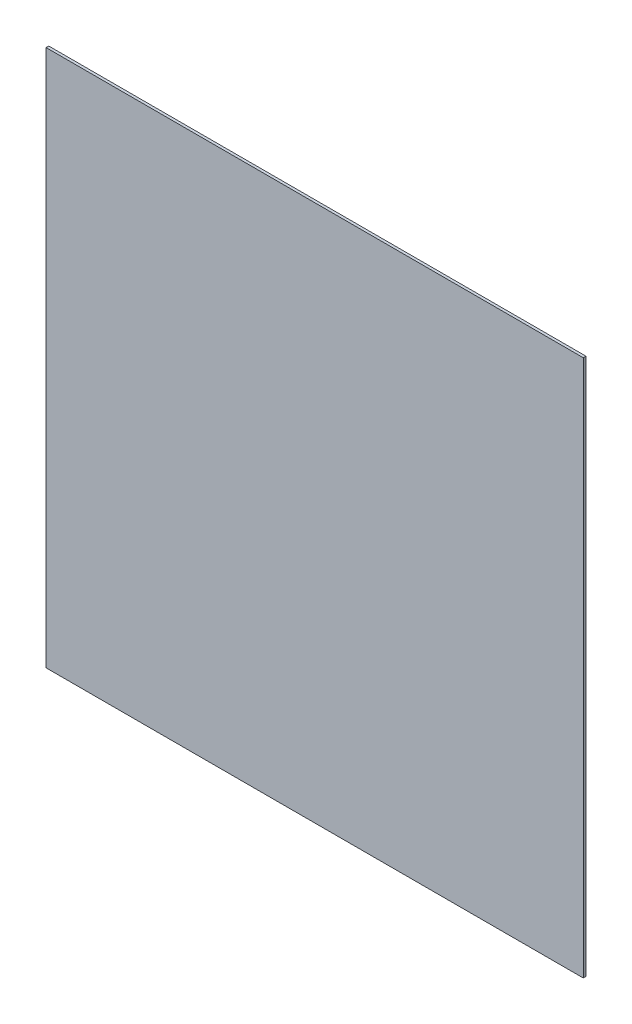
ISO-10303-21;
HEADER;
FILE_DESCRIPTION(('STEP AP214'),'2;1');
FILE_NAME('part.step','',(''),(''),'','','');
FILE_SCHEMA(('AUTOMOTIVE_DESIGN { 1 0 10303 214 1 1 1 1 }'));
ENDSEC;
DATA;
#1=APPLICATION_CONTEXT('core data for automotive mechanical design processes');
#2=APPLICATION_PROTOCOL_DEFINITION('international standard','automotive_design',2000,#1);
#3=PRODUCT_CONTEXT('',#1,'mechanical');
#4=PRODUCT('Part','Part','',(#3));
#5=PRODUCT_RELATED_PRODUCT_CATEGORY('part','',(#4));
#6=PRODUCT_DEFINITION_FORMATION('','',#4);
#7=PRODUCT_DEFINITION_CONTEXT('part definition',#1,'design');
#8=PRODUCT_DEFINITION('design','',#6,#7);
#9=PRODUCT_DEFINITION_SHAPE('','',#8);
#10=(LENGTH_UNIT() NAMED_UNIT(*) SI_UNIT(.MILLI.,.METRE.));
#11=(NAMED_UNIT(*) PLANE_ANGLE_UNIT() SI_UNIT($,.RADIAN.));
#12=(NAMED_UNIT(*) SI_UNIT($,.STERADIAN.) SOLID_ANGLE_UNIT());
#13=UNCERTAINTY_MEASURE_WITH_UNIT(LENGTH_MEASURE(1.E-05),#10,'distance_accuracy_value','');
#14=(GEOMETRIC_REPRESENTATION_CONTEXT(3) GLOBAL_UNCERTAINTY_ASSIGNED_CONTEXT((#13)) GLOBAL_UNIT_ASSIGNED_CONTEXT((#10,
#11,#12)) REPRESENTATION_CONTEXT('',''));
#15=CARTESIAN_POINT('',(0.,0.,0.));
#16=DIRECTION('',(0.,0.,1.));
#17=DIRECTION('',(1.,0.,0.));
#18=AXIS2_PLACEMENT_3D('',#15,#16,#17);
#19=CARTESIAN_POINT('',(-696.145124716553,94.671201814059,5.));
#20=DIRECTION('',(0.,1.,0.));
#21=DIRECTION('',(0.,0.,1.));
#22=AXIS2_PLACEMENT_3D('',#19,#20,#21);
#23=PLANE('',#22);
#24=DIRECTION('',(1.,0.,0.));
#25=VECTOR('',#24,1.);
#26=CARTESIAN_POINT('',(-696.145124716553,94.671201814059,0.));
#27=LINE('',#26,#25);
#28=CARTESIAN_POINT('',(-696.145124716553,94.671201814059,0.));
#29=VERTEX_POINT('',#28);
#30=CARTESIAN_POINT('',(303.854875283447,94.671201814059,0.));
#31=VERTEX_POINT('',#30);
#32=EDGE_CURVE('E98',#29,#31,#27,.T.);
#33=ORIENTED_EDGE('',*,*,#32,.F.);
#34=DIRECTION('',(0.,0.,-1.));
#35=VECTOR('',#34,1.);
#36=CARTESIAN_POINT('',(-696.145124716553,94.671201814059,5.));
#37=LINE('',#36,#35);
#38=CARTESIAN_POINT('',(-696.145124716553,94.671201814059,5.));
#39=VERTEX_POINT('',#38);
#40=EDGE_CURVE('E11',#39,#29,#37,.T.);
#41=ORIENTED_EDGE('',*,*,#40,.F.);
#42=DIRECTION('',(1.,0.,0.));
#43=VECTOR('',#42,1.);
#44=CARTESIAN_POINT('',(-696.145124716553,94.671201814059,5.));
#45=LINE('',#44,#43);
#46=CARTESIAN_POINT('',(303.854875283447,94.671201814059,5.));
#47=VERTEX_POINT('',#46);
#48=EDGE_CURVE('E93',#39,#47,#45,.T.);
#49=ORIENTED_EDGE('',*,*,#48,.T.);
#50=DIRECTION('',(0.,0.,-1.));
#51=VECTOR('',#50,1.);
#52=CARTESIAN_POINT('',(303.854875283447,94.671201814059,5.));
#53=LINE('',#52,#51);
#54=EDGE_CURVE('E36',#47,#31,#53,.T.);
#55=ORIENTED_EDGE('',*,*,#54,.T.);
#56=EDGE_LOOP('',(#33,#41,#49,#55));
#57=FACE_BOUND('',#56,.T.);
#58=ADVANCED_FACE('F33',(#57),#23,.T.);
#59=CARTESIAN_POINT('',(-696.145124716553,94.671201814059,5.));
#60=DIRECTION('',(1.,0.,0.));
#61=DIRECTION('',(0.,0.,-1.));
#62=AXIS2_PLACEMENT_3D('',#59,#60,#61);
#63=PLANE('',#62);
#64=DIRECTION('',(0.,-1.,0.));
#65=VECTOR('',#64,1.);
#66=CARTESIAN_POINT('',(-696.145124716553,94.671201814059,0.));
#67=LINE('',#66,#65);
#68=CARTESIAN_POINT('',(-696.145124716553,-905.328798185941,0.));
#69=VERTEX_POINT('',#68);
#70=EDGE_CURVE('E66',#29,#69,#67,.T.);
#71=ORIENTED_EDGE('',*,*,#70,.T.);
#72=DIRECTION('',(0.,0.,-1.));
#73=VECTOR('',#72,1.);
#74=CARTESIAN_POINT('',(-696.145124716553,-905.328798185941,5.));
#75=LINE('',#74,#73);
#76=CARTESIAN_POINT('',(-696.145124716553,-905.328798185941,5.));
#77=VERTEX_POINT('',#76);
#78=EDGE_CURVE('E42',#77,#69,#75,.T.);
#79=ORIENTED_EDGE('',*,*,#78,.F.);
#80=DIRECTION('',(0.,-1.,0.));
#81=VECTOR('',#80,1.);
#82=CARTESIAN_POINT('',(-696.145124716553,94.671201814059,5.));
#83=LINE('',#82,#81);
#84=EDGE_CURVE('E83',#39,#77,#83,.T.);
#85=ORIENTED_EDGE('',*,*,#84,.F.);
#86=ORIENTED_EDGE('',*,*,#40,.T.);
#87=EDGE_LOOP('',(#71,#79,#85,#86));
#88=FACE_BOUND('',#87,.T.);
#89=ADVANCED_FACE('F108',(#88),#63,.F.);
#90=CARTESIAN_POINT('',(-696.145124716553,-905.328798185941,5.));
#91=DIRECTION('',(0.,1.,0.));
#92=DIRECTION('',(0.,0.,1.));
#93=AXIS2_PLACEMENT_3D('',#90,#91,#92);
#94=PLANE('',#93);
#95=DIRECTION('',(1.,0.,0.));
#96=VECTOR('',#95,1.);
#97=CARTESIAN_POINT('',(-696.145124716553,-905.328798185941,0.));
#98=LINE('',#97,#96);
#99=CARTESIAN_POINT('',(303.854875283447,-905.328798185941,0.));
#100=VERTEX_POINT('',#99);
#101=EDGE_CURVE('E90',#69,#100,#98,.T.);
#102=ORIENTED_EDGE('',*,*,#101,.T.);
#103=DIRECTION('',(0.,0.,-1.));
#104=VECTOR('',#103,1.);
#105=CARTESIAN_POINT('',(303.854875283447,-905.328798185941,5.));
#106=LINE('',#105,#104);
#107=CARTESIAN_POINT('',(303.854875283447,-905.328798185941,5.));
#108=VERTEX_POINT('',#107);
#109=EDGE_CURVE('E87',#108,#100,#106,.T.);
#110=ORIENTED_EDGE('',*,*,#109,.F.);
#111=DIRECTION('',(1.,0.,0.));
#112=VECTOR('',#111,1.);
#113=CARTESIAN_POINT('',(-696.145124716553,-905.328798185941,5.));
#114=LINE('',#113,#112);
#115=EDGE_CURVE('E78',#77,#108,#114,.T.);
#116=ORIENTED_EDGE('',*,*,#115,.F.);
#117=ORIENTED_EDGE('',*,*,#78,.T.);
#118=EDGE_LOOP('',(#102,#110,#116,#117));
#119=FACE_BOUND('',#118,.T.);
#120=ADVANCED_FACE('F88',(#119),#94,.F.);
#121=CARTESIAN_POINT('',(303.854875283447,94.671201814059,5.));
#122=DIRECTION('',(1.,0.,0.));
#123=DIRECTION('',(0.,1.,0.));
#124=AXIS2_PLACEMENT_3D('',#121,#122,#123);
#125=PLANE('',#124);
#126=DIRECTION('',(0.,-1.,0.));
#127=VECTOR('',#126,1.);
#128=CARTESIAN_POINT('',(303.854875283447,94.671201814059,0.));
#129=LINE('',#128,#127);
#130=EDGE_CURVE('E101',#31,#100,#129,.T.);
#131=ORIENTED_EDGE('',*,*,#130,.F.);
#132=ORIENTED_EDGE('',*,*,#54,.F.);
#133=DIRECTION('',(0.,-1.,0.));
#134=VECTOR('',#133,1.);
#135=CARTESIAN_POINT('',(303.854875283447,94.671201814059,5.));
#136=LINE('',#135,#134);
#137=EDGE_CURVE('E82',#47,#108,#136,.T.);
#138=ORIENTED_EDGE('',*,*,#137,.T.);
#139=ORIENTED_EDGE('',*,*,#109,.T.);
#140=EDGE_LOOP('',(#131,#132,#138,#139));
#141=FACE_BOUND('',#140,.T.);
#142=ADVANCED_FACE('F92',(#141),#125,.T.);
#143=CARTESIAN_POINT('',(0.,0.,5.));
#144=DIRECTION('',(0.,0.,-1.));
#145=DIRECTION('',(-1.,0.,0.));
#146=AXIS2_PLACEMENT_3D('',#143,#144,#145);
#147=PLANE('',#146);
#148=ORIENTED_EDGE('',*,*,#48,.F.);
#149=ORIENTED_EDGE('',*,*,#84,.T.);
#150=ORIENTED_EDGE('',*,*,#115,.T.);
#151=ORIENTED_EDGE('',*,*,#137,.F.);
#152=EDGE_LOOP('',(#148,#149,#150,#151));
#153=FACE_BOUND('',#152,.T.);
#154=ADVANCED_FACE('F81',(#153),#147,.F.);
#155=CARTESIAN_POINT('',(0.,0.,0.));
#156=DIRECTION('',(0.,0.,-1.));
#157=DIRECTION('',(-1.,0.,0.));
#158=AXIS2_PLACEMENT_3D('',#155,#156,#157);
#159=PLANE('',#158);
#160=ORIENTED_EDGE('',*,*,#32,.T.);
#161=ORIENTED_EDGE('',*,*,#130,.T.);
#162=ORIENTED_EDGE('',*,*,#101,.F.);
#163=ORIENTED_EDGE('',*,*,#70,.F.);
#164=EDGE_LOOP('',(#160,#161,#162,#163));
#165=FACE_BOUND('',#164,.T.);
#166=ADVANCED_FACE('F106',(#165),#159,.T.);
#167=CLOSED_SHELL('',(#58,#89,#120,#142,#154,#166));
#168=MANIFOLD_SOLID_BREP('B2',#167);
#169=ADVANCED_BREP_SHAPE_REPRESENTATION('',(#18,#168),#14);
#170=SHAPE_DEFINITION_REPRESENTATION(#9,#169);
ENDSEC;
END-ISO-10303-21;
